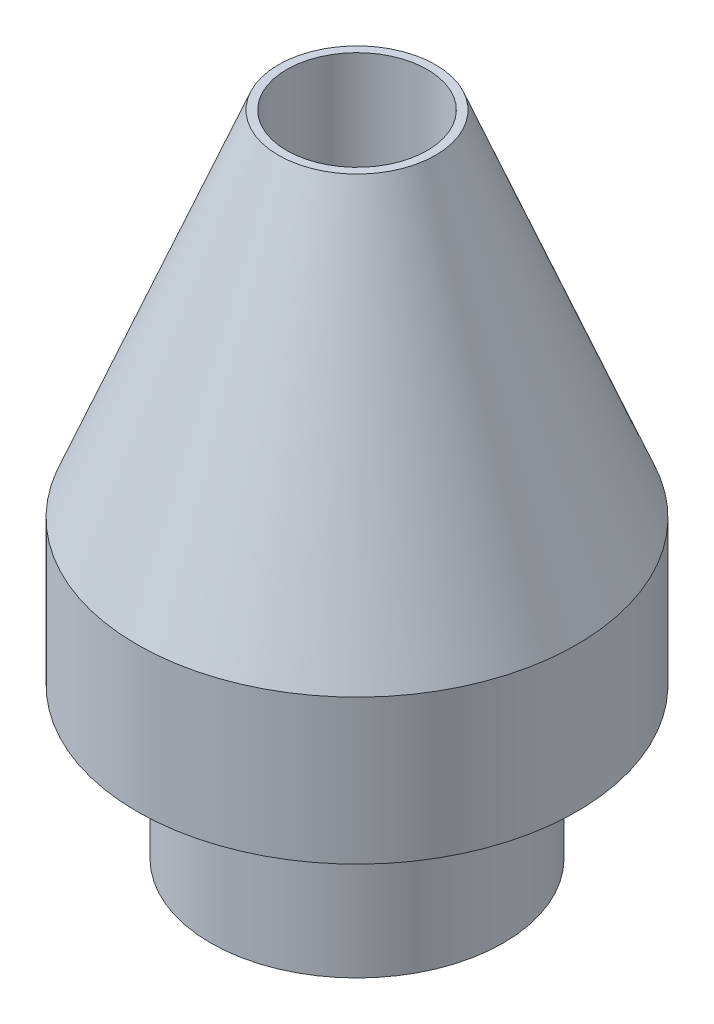
ISO-10303-21;
HEADER;
FILE_DESCRIPTION(('STEP AP214'),'2;1');
FILE_NAME('part.step','',(''),(''),'','','');
FILE_SCHEMA(('AUTOMOTIVE_DESIGN { 1 0 10303 214 1 1 1 1 }'));
ENDSEC;
DATA;
#1=APPLICATION_CONTEXT('core data for automotive mechanical design processes');
#2=APPLICATION_PROTOCOL_DEFINITION('international standard','automotive_design',2000,#1);
#3=PRODUCT_CONTEXT('',#1,'mechanical');
#4=PRODUCT('Part','Part','',(#3));
#5=PRODUCT_RELATED_PRODUCT_CATEGORY('part','',(#4));
#6=PRODUCT_DEFINITION_FORMATION('','',#4);
#7=PRODUCT_DEFINITION_CONTEXT('part definition',#1,'design');
#8=PRODUCT_DEFINITION('design','',#6,#7);
#9=PRODUCT_DEFINITION_SHAPE('','',#8);
#10=(LENGTH_UNIT() NAMED_UNIT(*) SI_UNIT(.MILLI.,.METRE.));
#11=(NAMED_UNIT(*) PLANE_ANGLE_UNIT() SI_UNIT($,.RADIAN.));
#12=(NAMED_UNIT(*) SI_UNIT($,.STERADIAN.) SOLID_ANGLE_UNIT());
#13=UNCERTAINTY_MEASURE_WITH_UNIT(LENGTH_MEASURE(1.E-05),#10,'distance_accuracy_value','');
#14=(GEOMETRIC_REPRESENTATION_CONTEXT(3) GLOBAL_UNCERTAINTY_ASSIGNED_CONTEXT((#13)) GLOBAL_UNIT_ASSIGNED_CONTEXT((#10,
#11,#12)) REPRESENTATION_CONTEXT('',''));
#15=CARTESIAN_POINT('',(0.,0.,0.));
#16=DIRECTION('',(0.,0.,1.));
#17=DIRECTION('',(1.,0.,0.));
#18=AXIS2_PLACEMENT_3D('',#15,#16,#17);
#19=CARTESIAN_POINT('',(0.,6.477,0.));
#20=DIRECTION('',(0.,-1.,0.));
#21=DIRECTION('',(0.,0.,-1.));
#22=AXIS2_PLACEMENT_3D('',#19,#20,#21);
#23=CYLINDRICAL_SURFACE('',#22,6.2992);
#24=CARTESIAN_POINT('',(0.,6.477,0.));
#25=DIRECTION('',(0.,1.,0.));
#26=DIRECTION('',(0.,0.,1.));
#27=AXIS2_PLACEMENT_3D('',#24,#25,#26);
#28=CIRCLE('',#27,6.2992);
#29=CARTESIAN_POINT('',(0.,6.477,6.2992));
#30=VERTEX_POINT('',#29);
#31=EDGE_CURVE('E11',#30,#30,#28,.T.);
#32=ORIENTED_EDGE('',*,*,#31,.F.);
#33=EDGE_LOOP('',(#32));
#34=FACE_BOUND('',#33,.T.);
#35=CARTESIAN_POINT('',(0.,0.,0.));
#36=DIRECTION('',(0.,1.,0.));
#37=DIRECTION('',(0.,0.,1.));
#38=AXIS2_PLACEMENT_3D('',#35,#36,#37);
#39=CIRCLE('',#38,6.2992);
#40=CARTESIAN_POINT('',(0.,0.,6.2992));
#41=VERTEX_POINT('',#40);
#42=EDGE_CURVE('E40',#41,#41,#39,.T.);
#43=ORIENTED_EDGE('',*,*,#42,.T.);
#44=EDGE_LOOP('',(#43));
#45=FACE_BOUND('',#44,.T.);
#46=ADVANCED_FACE('F33',(#34,#45),#23,.T.);
#47=CARTESIAN_POINT('',(0.,0.,0.));
#48=DIRECTION('',(0.,1.,0.));
#49=DIRECTION('',(0.,0.,1.));
#50=AXIS2_PLACEMENT_3D('',#47,#48,#49);
#51=PLANE('',#50);
#52=CARTESIAN_POINT('',(0.,0.,0.));
#53=DIRECTION('',(0.,1.,0.));
#54=DIRECTION('',(0.,0.,1.));
#55=AXIS2_PLACEMENT_3D('',#52,#53,#54);
#56=CIRCLE('',#55,3.0226);
#57=CARTESIAN_POINT('',(0.,0.,3.0226));
#58=VERTEX_POINT('',#57);
#59=EDGE_CURVE('E58',#58,#58,#56,.T.);
#60=ORIENTED_EDGE('',*,*,#59,.T.);
#61=EDGE_LOOP('',(#60));
#62=FACE_BOUND('',#61,.T.);
#63=ORIENTED_EDGE('',*,*,#42,.F.);
#64=EDGE_LOOP('',(#63));
#65=FACE_BOUND('',#64,.T.);
#66=ADVANCED_FACE('F90',(#62,#65),#51,.F.);
#67=CARTESIAN_POINT('',(0.,6.477,0.));
#68=DIRECTION('',(0.,1.,0.));
#69=DIRECTION('',(0.,0.,1.));
#70=AXIS2_PLACEMENT_3D('',#67,#68,#69);
#71=PLANE('',#70);
#72=CARTESIAN_POINT('',(0.,6.477,0.));
#73=DIRECTION('',(0.,1.,0.));
#74=DIRECTION('',(0.,0.,1.));
#75=AXIS2_PLACEMENT_3D('',#72,#73,#74);
#76=CIRCLE('',#75,9.4615);
#77=CARTESIAN_POINT('',(0.,6.477,9.4615));
#78=VERTEX_POINT('',#77);
#79=EDGE_CURVE('E48',#78,#78,#76,.T.);
#80=ORIENTED_EDGE('',*,*,#79,.F.);
#81=EDGE_LOOP('',(#80));
#82=FACE_BOUND('',#81,.T.);
#83=ORIENTED_EDGE('',*,*,#31,.T.);
#84=EDGE_LOOP('',(#83));
#85=FACE_BOUND('',#84,.T.);
#86=ADVANCED_FACE('F87',(#82,#85),#71,.F.);
#87=CARTESIAN_POINT('',(0.,12.7,0.));
#88=DIRECTION('',(0.,-1.,0.));
#89=DIRECTION('',(0.,0.,-1.));
#90=AXIS2_PLACEMENT_3D('',#87,#88,#89);
#91=CYLINDRICAL_SURFACE('',#90,9.4615);
#92=CARTESIAN_POINT('',(0.,12.7,0.));
#93=DIRECTION('',(0.,-1.,0.));
#94=DIRECTION('',(0.,0.,-1.));
#95=AXIS2_PLACEMENT_3D('',#92,#93,#94);
#96=CIRCLE('',#95,9.4615);
#97=CARTESIAN_POINT('',(0.,12.7,-9.4615));
#98=VERTEX_POINT('',#97);
#99=EDGE_CURVE('E45',#98,#98,#96,.F.);
#100=ORIENTED_EDGE('',*,*,#99,.F.);
#101=EDGE_LOOP('',(#100));
#102=FACE_BOUND('',#101,.T.);
#103=ORIENTED_EDGE('',*,*,#79,.T.);
#104=EDGE_LOOP('',(#103));
#105=FACE_BOUND('',#104,.T.);
#106=ADVANCED_FACE('F83',(#102,#105),#91,.T.);
#107=CARTESIAN_POINT('',(0.,27.8892,0.));
#108=DIRECTION('',(0.,1.,0.));
#109=DIRECTION('',(0.,0.,1.));
#110=AXIS2_PLACEMENT_3D('',#107,#108,#109);
#111=PLANE('',#110);
#112=CARTESIAN_POINT('',(0.,27.8892,0.));
#113=DIRECTION('',(0.,1.,0.));
#114=DIRECTION('',(0.,0.,1.));
#115=AXIS2_PLACEMENT_3D('',#112,#113,#114);
#116=CIRCLE('',#115,3.0226);
#117=CARTESIAN_POINT('',(0.,27.8892,3.0226));
#118=VERTEX_POINT('',#117);
#119=EDGE_CURVE('E64',#118,#118,#116,.T.);
#120=ORIENTED_EDGE('',*,*,#119,.F.);
#121=EDGE_LOOP('',(#120));
#122=FACE_BOUND('',#121,.T.);
#123=CARTESIAN_POINT('',(0.,27.8892,0.));
#124=DIRECTION('',(0.,1.,0.));
#125=DIRECTION('',(0.,0.,1.));
#126=AXIS2_PLACEMENT_3D('',#123,#124,#125);
#127=CIRCLE('',#126,3.3782);
#128=CARTESIAN_POINT('',(0.,27.8892,3.3782));
#129=VERTEX_POINT('',#128);
#130=EDGE_CURVE('E54',#129,#129,#127,.T.);
#131=ORIENTED_EDGE('',*,*,#130,.T.);
#132=EDGE_LOOP('',(#131));
#133=FACE_BOUND('',#132,.T.);
#134=ADVANCED_FACE('F72',(#122,#133),#111,.T.);
#135=CARTESIAN_POINT('',(0.,27.8892,0.));
#136=DIRECTION('',(0.,-1.,0.));
#137=DIRECTION('',(0.,0.,-1.));
#138=AXIS2_PLACEMENT_3D('',#135,#136,#137);
#139=CONICAL_SURFACE('',#138,3.3782,0.380938778353793);
#140=ORIENTED_EDGE('',*,*,#99,.T.);
#141=EDGE_LOOP('',(#140));
#142=FACE_BOUND('',#141,.T.);
#143=ORIENTED_EDGE('',*,*,#130,.F.);
#144=EDGE_LOOP('',(#143));
#145=FACE_BOUND('',#144,.T.);
#146=ADVANCED_FACE('F82',(#142,#145),#139,.T.);
#147=CARTESIAN_POINT('',(0.,0.,0.));
#148=DIRECTION('',(0.,1.,0.));
#149=DIRECTION('',(0.,0.,1.));
#150=AXIS2_PLACEMENT_3D('',#147,#148,#149);
#151=CYLINDRICAL_SURFACE('',#150,3.0226);
#152=ORIENTED_EDGE('',*,*,#59,.F.);
#153=EDGE_LOOP('',(#152));
#154=FACE_BOUND('',#153,.T.);
#155=ORIENTED_EDGE('',*,*,#119,.T.);
#156=EDGE_LOOP('',(#155));
#157=FACE_BOUND('',#156,.T.);
#158=ADVANCED_FACE('F105',(#154,#157),#151,.F.);
#159=CLOSED_SHELL('',(#46,#66,#86,#106,#134,#146,#158));
#160=MANIFOLD_SOLID_BREP('B2',#159);
#161=ADVANCED_BREP_SHAPE_REPRESENTATION('',(#18,#160),#14);
#162=SHAPE_DEFINITION_REPRESENTATION(#9,#161);
ENDSEC;
END-ISO-10303-21;
